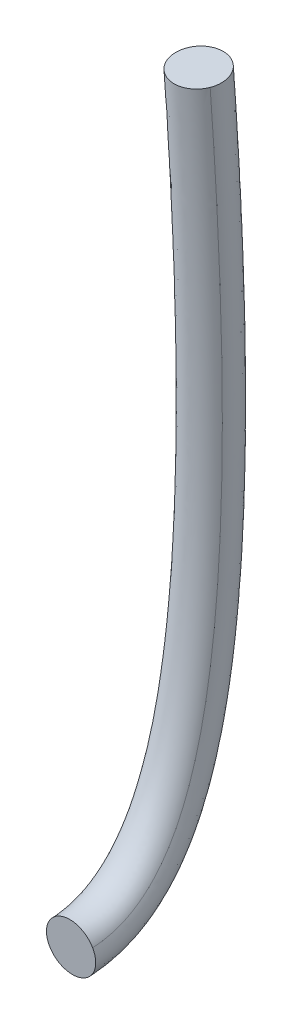
ISO-10303-21;
HEADER;
FILE_DESCRIPTION(('STEP AP214'),'2;1');
FILE_NAME('part.step','',(''),(''),'','','');
FILE_SCHEMA(('AUTOMOTIVE_DESIGN { 1 0 10303 214 1 1 1 1 }'));
ENDSEC;
DATA;
#1=APPLICATION_CONTEXT('core data for automotive mechanical design processes');
#2=APPLICATION_PROTOCOL_DEFINITION('international standard','automotive_design',2000,#1);
#3=PRODUCT_CONTEXT('',#1,'mechanical');
#4=PRODUCT('Part','Part','',(#3));
#5=PRODUCT_RELATED_PRODUCT_CATEGORY('part','',(#4));
#6=PRODUCT_DEFINITION_FORMATION('','',#4);
#7=PRODUCT_DEFINITION_CONTEXT('part definition',#1,'design');
#8=PRODUCT_DEFINITION('design','',#6,#7);
#9=PRODUCT_DEFINITION_SHAPE('','',#8);
#10=(LENGTH_UNIT() NAMED_UNIT(*) SI_UNIT(.MILLI.,.METRE.));
#11=(NAMED_UNIT(*) PLANE_ANGLE_UNIT() SI_UNIT($,.RADIAN.));
#12=(NAMED_UNIT(*) SI_UNIT($,.STERADIAN.) SOLID_ANGLE_UNIT());
#13=UNCERTAINTY_MEASURE_WITH_UNIT(LENGTH_MEASURE(1.E-05),#10,'distance_accuracy_value','');
#14=(GEOMETRIC_REPRESENTATION_CONTEXT(3) GLOBAL_UNCERTAINTY_ASSIGNED_CONTEXT((#13)) GLOBAL_UNIT_ASSIGNED_CONTEXT((#10,
#11,#12)) REPRESENTATION_CONTEXT('',''));
#15=CARTESIAN_POINT('',(0.,0.,0.));
#16=DIRECTION('',(0.,0.,1.));
#17=DIRECTION('',(1.,0.,0.));
#18=AXIS2_PLACEMENT_3D('',#15,#16,#17);
#19=CARTESIAN_POINT('',(4.01287620497938,-7.28809493712318,11.1726740111274));
#20=CARTESIAN_POINT('',(4.01287620497948,-7.28391225419948,11.0968550305643));
#21=CARTESIAN_POINT('',(4.01287620497963,-7.25716119494319,10.9541601069187));
#22=CARTESIAN_POINT('',(4.01287620497976,-7.1314491176281,10.6996024126014));
#23=CARTESIAN_POINT('',(4.01287620497965,-6.82482587490301,10.4240608609218));
#24=CARTESIAN_POINT('',(4.01287620497927,-6.165873157696,10.1770941489155));
#25=CARTESIAN_POINT('',(4.01287620497877,-5.06029644687231,10.0061296705981));
#26=CARTESIAN_POINT('',(4.01287620497848,-3.38305310437188,9.96226618792651));
#27=CARTESIAN_POINT('',(4.01287620497894,-1.8408728210868,10.0365898836467));
#28=CARTESIAN_POINT('',(4.01287620497939,-1.00711974407007,10.0974833884059));
#29=CARTESIAN_POINT('',(3.98375290779098,-7.22774571862693,11.1760032783344));
#30=CARTESIAN_POINT('',(3.98375290779108,-7.22383965460085,11.1051985346152));
#31=CARTESIAN_POINT('',(3.98375290779123,-7.19892557519891,10.9732426989536));
#32=CARTESIAN_POINT('',(3.98375290779136,-7.08368813312381,10.739637495315));
#33=CARTESIAN_POINT('',(3.98375290779126,-6.79660600562802,10.479005346914));
#34=CARTESIAN_POINT('',(3.98375290779087,-6.15268216176301,10.2363583456067));
#35=CARTESIAN_POINT('',(3.98375290779038,-5.05654613295629,10.0666574594048));
#36=CARTESIAN_POINT('',(3.98375290779009,-3.3843495567675,10.0227004836965));
#37=CARTESIAN_POINT('',(3.98375290779054,-1.84433494354683,10.096938994066));
#38=CARTESIAN_POINT('',(3.98375290779099,-1.0115223498947,10.1577638102292));
#39=CARTESIAN_POINT('',(3.88201580447954,-7.14685073277138,11.1804659877171));
#40=CARTESIAN_POINT('',(3.88201580447964,-7.14331545469164,11.1163824353893));
#41=CARTESIAN_POINT('',(3.88201580447979,-7.12086386158283,10.9988217341809));
#42=CARTESIAN_POINT('',(3.88201580447992,-7.01966693643439,10.7933018546966));
#43=CARTESIAN_POINT('',(3.88201580447982,-6.75877859430067,10.5526550544248));
#44=CARTESIAN_POINT('',(3.88201580447943,-6.13500008848618,10.3157985827973));
#45=CARTESIAN_POINT('',(3.88201580447894,-5.05151887425311,10.1477916249694));
#46=CARTESIAN_POINT('',(3.88201580447865,-3.38608722835044,10.1037094182803));
#47=CARTESIAN_POINT('',(3.88201580447911,-1.8489757632529,10.1778338332407));
#48=CARTESIAN_POINT('',(3.88201580447955,-1.01742381382055,10.238566577726));
#49=CARTESIAN_POINT('',(3.70452611217511,-7.1676447435489,11.1793188507711));
#50=CARTESIAN_POINT('',(3.7045261121752,-7.16401384147644,11.1135019340509));
#51=CARTESIAN_POINT('',(3.70452611217535,-7.14093402141678,10.9922386488074));
#52=CARTESIAN_POINT('',(3.70452611217548,-7.0361199670932,10.7794822799129));
#53=CARTESIAN_POINT('',(3.70452611217538,-6.76849584205155,10.5337012343682));
#54=CARTESIAN_POINT('',(3.704526112175,-6.13953535833464,10.2953641607092));
#55=CARTESIAN_POINT('',(3.7045261121745,-5.05280432098519,10.1269281905872));
#56=CARTESIAN_POINT('',(3.70452611217422,-3.38563387235592,10.082882116471));
#57=CARTESIAN_POINT('',(3.70452611217467,-1.8477839096128,10.1570397822777));
#58=CARTESIAN_POINT('',(3.70452611217512,-1.01590684582571,10.217796271626));
#59=CARTESIAN_POINT('',(3.60405824176924,-7.26777335942295,11.173795085499));
#60=CARTESIAN_POINT('',(3.60405824176934,-7.26368440808216,11.0996751658486));
#61=CARTESIAN_POINT('',(3.60405824176949,-7.23754305715789,10.9606007791927));
#62=CARTESIAN_POINT('',(3.60405824176961,-7.11537309349189,10.7131305001567));
#63=CARTESIAN_POINT('',(3.60405824176951,-6.81533499688619,10.4426038864468));
#64=CARTESIAN_POINT('',(3.60405824176912,-6.1614497666812,10.1970771266467));
#65=CARTESIAN_POINT('',(3.60405824176863,-5.05904628454727,10.0265261880134));
#66=CARTESIAN_POINT('',(3.60405824176834,-3.38350213363878,9.98262387314061));
#67=CARTESIAN_POINT('',(3.6040582417688,-1.84203664376369,10.0569115701813));
#68=CARTESIAN_POINT('',(3.60405824176925,-1.0086022470513,10.1177817999912));
#69=CARTESIAN_POINT('',(3.58500000000068,-7.35208061372048,11.1691441325282));
#70=CARTESIAN_POINT('',(3.58500000000077,-7.34760369485504,11.0879915731232));
#71=CARTESIAN_POINT('',(3.58500000000092,-7.31891934484953,10.9339034308183));
#72=CARTESIAN_POINT('',(3.58500000000105,-7.18207719647453,10.6570787672874));
#73=CARTESIAN_POINT('',(3.58500000000094,-6.854727228942,10.3657384236238));
#74=CARTESIAN_POINT('',(3.58500000000056,-6.17982906409538,10.1142154553458));
#75=CARTESIAN_POINT('',(3.58500000000007,-5.06425215150658,9.94193063774786));
#76=CARTESIAN_POINT('',(3.58499999999978,-3.38165829949396,9.89817820607483));
#77=CARTESIAN_POINT('',(3.58500000000023,-1.83720530777411,9.97260408602737));
#78=CARTESIAN_POINT('',(3.58500000000068,-1.00245185077312,10.0335706539573));
#79=CARTESIAN_POINT('',(3.585,-7.38568943191456,11.1672900449514));
#80=CARTESIAN_POINT('',(3.58500000000009,-7.3810594674981,11.0833632476063));
#81=CARTESIAN_POINT('',(3.58500000000024,-7.35133686118168,10.9233018896209));
#82=CARTESIAN_POINT('',(3.58500000000037,-7.20868703416058,10.634863690535));
#83=CARTESIAN_POINT('',(3.58500000000027,-6.87046311339161,10.3352106768981));
#84=CARTESIAN_POINT('',(3.58499999999988,-6.18720691602205,10.0812568834996));
#85=CARTESIAN_POINT('',(3.58499999999939,-5.06636253415994,9.90824782223525));
#86=CARTESIAN_POINT('',(3.5849999999991,-3.38095772899273,9.86453482642554));
#87=CARTESIAN_POINT('',(3.58499999999955,-1.83527381521949,9.93899557759439));
#88=CARTESIAN_POINT('',(3.585,-1.00000001490137,10.0000001490162));
#89=B_SPLINE_SURFACE_WITH_KNOTS('',3,3,((#19,#20,#21,#22,#23,#24,#25,#26,#27,#28),(#29,#30,#31,
#32,#33,#34,#35,#36,#37,#38),(#39,#40,#41,#42,#43,#44,#45,#46,#47,#48),(#49,#50,#51,#52,#53,#54,
#55,#56,#57,#58),(#59,#60,#61,#62,#63,#64,#65,#66,#67,#68),(#69,#70,#71,#72,#73,#74,#75,#76,#77,
#78),(#79,#80,#81,#82,#83,#84,#85,#86,#87,#88)),.UNSPECIFIED.,.F.,.F.,.F.,(4,1,1,1,4),(4,1,1,1,
1,1,1,4),(0.448798950512828,1.34639685153848,2.01959527730772,2.69279370307697,
3.14159265358979),(0.,0.0714285714285714,0.142857142857143,0.285714285714286,0.428571428571429,
0.571428571428571,0.785714285714286,1.),.UNSPECIFIED.);
#90=CARTESIAN_POINT('',(3.585,-7.38568943191456,11.1672900449514));
#91=CARTESIAN_POINT('',(3.58500000000009,-7.3810594674981,11.0833632476063));
#92=CARTESIAN_POINT('',(3.58500000000024,-7.35133686118168,10.9233018896209));
#93=CARTESIAN_POINT('',(3.58500000000037,-7.20868703416058,10.634863690535));
#94=CARTESIAN_POINT('',(3.58500000000027,-6.87046311339161,10.3352106768981));
#95=CARTESIAN_POINT('',(3.58499999999988,-6.18720691602205,10.0812568834996));
#96=CARTESIAN_POINT('',(3.58499999999939,-5.06636253415994,9.90824782223525));
#97=CARTESIAN_POINT('',(3.5849999999991,-3.38095772899273,9.86453482642554));
#98=CARTESIAN_POINT('',(3.58499999999955,-1.83527381521949,9.93899557759439));
#99=CARTESIAN_POINT('',(3.585,-1.00000001490137,10.0000001490162));
#100=B_SPLINE_CURVE_WITH_KNOTS('',3,(#90,#91,#92,#93,#94,#95,#96,#97,#98,#99),.UNSPECIFIED.,.F.,
.F.,(4,1,1,1,1,1,1,4),(0.,0.0714285714285714,0.142857142857143,0.285714285714286,
0.428571428571429,0.571428571428571,0.785714285714286,1.),.UNSPECIFIED.);
#101=CARTESIAN_POINT('',(3.585,-7.38568943191456,11.1672900449514));
#102=VERTEX_POINT('',#101);
#103=CARTESIAN_POINT('',(3.585,-1.00000001490137,10.0000001490162));
#104=VERTEX_POINT('',#103);
#105=EDGE_CURVE('E11',#102,#104,#100,.T.);
#106=CARTESIAN_POINT('',(3.585,-7.38568943191456,11.1672900449514));
#107=CARTESIAN_POINT('',(3.58500897395703,-7.3983816093523,11.1665898594116));
#108=CARTESIAN_POINT('',(3.58613098343656,-7.41108378688621,11.1658891221995));
#109=CARTESIAN_POINT('',(3.59051216233813,-7.43613058949724,11.1645073727642));
#110=CARTESIAN_POINT('',(3.59377562751158,-7.4484744436958,11.1638264030679));
#111=CARTESIAN_POINT('',(3.60228032219361,-7.47243498249087,11.1625045792223));
#112=CARTESIAN_POINT('',(3.60751752800551,-7.48405309080503,11.1618636465311));
#113=CARTESIAN_POINT('',(3.61983572155987,-7.50626221756838,11.1606384423069));
#114=CARTESIAN_POINT('',(3.62691564724126,-7.5168538228379,11.1600541384008));
#115=CARTESIAN_POINT('',(3.64289444961349,-7.53685977257439,11.1589504761818));
#116=CARTESIAN_POINT('',(3.65182083606302,-7.54625236056585,11.1584323181018));
#117=CARTESIAN_POINT('',(3.67122368934338,-7.56326927128758,11.1574935513001));
#118=CARTESIAN_POINT('',(3.68169927755292,-7.57089459006273,11.1570728876299));
#119=CARTESIAN_POINT('',(3.70322424042484,-7.58383189645702,11.1563591791347));
#120=CARTESIAN_POINT('',(3.71421265075988,-7.5892460713144,11.1560604969768));
#121=CARTESIAN_POINT('',(3.73691686089652,-7.59828458911192,11.1555618717808));
#122=CARTESIAN_POINT('',(3.7486335454821,-7.60190670506499,11.1553620515981));
#123=CARTESIAN_POINT('',(3.77315340294371,-7.60743276165738,11.1550571972942));
#124=CARTESIAN_POINT('',(3.78598078448956,-7.60923017552701,11.1549580399033));
#125=CARTESIAN_POINT('',(3.8117445934974,-7.61065910097915,11.1548792108022));
#126=CARTESIAN_POINT('',(3.82468085849553,-7.61029341040312,11.1548993847443));
#127=CARTESIAN_POINT('',(3.85025549109904,-7.60727026510154,11.155066161693));
#128=CARTESIAN_POINT('',(3.86289454775911,-7.60461879104279,11.1552124347659));
#129=CARTESIAN_POINT('',(3.88749119500077,-7.59709046615236,11.1556277476035));
#130=CARTESIAN_POINT('',(3.89944839783918,-7.59221236304532,11.1558968564522));
#131=CARTESIAN_POINT('',(3.92179051200648,-7.58083360871834,11.1565245847738));
#132=CARTESIAN_POINT('',(3.93222440178752,-7.57442775476059,11.1568779745948));
#133=CARTESIAN_POINT('',(3.95197552274883,-7.56007387970219,11.1576698305081));
#134=CARTESIAN_POINT('',(3.96129210740674,-7.55212497262175,11.158108345477));
#135=CARTESIAN_POINT('',(3.97922168959575,-7.53420906627699,11.1590967069001));
#136=CARTESIAN_POINT('',(3.98772836061025,-7.52413497353887,11.1596524613479));
#137=CARTESIAN_POINT('',(4.00280995574618,-7.50266405543227,11.160836941037));
#138=CARTESIAN_POINT('',(4.00938781766167,-7.49126927894329,11.1614655532484));
#139=CARTESIAN_POINT('',(4.02513007614966,-7.45681821240821,11.1633661048863));
#140=CARTESIAN_POINT('',(4.03142271536091,-7.43237451709741,11.1647145828824));
#141=CARTESIAN_POINT('',(4.03492525666866,-7.39526756721628,11.1667616508391));
#142=CARTESIAN_POINT('',(4.03508821265541,-7.38275776019196,11.1674517756051));
#143=CARTESIAN_POINT('',(4.0334220682958,-7.35785666288847,11.1688254869594));
#144=CARTESIAN_POINT('',(4.03159405692614,-7.34546531155682,11.1695090769158));
#145=CARTESIAN_POINT('',(4.02578544840758,-7.32053644450116,11.1708843202357));
#146=CARTESIAN_POINT('',(4.02170194045113,-7.30802251664015,11.1715746723347));
#147=CARTESIAN_POINT('',(4.01127814286342,-7.28397227606187,11.1729014447317));
#148=CARTESIAN_POINT('',(4.00493921468446,-7.27243537876386,11.173537897279));
#149=CARTESIAN_POINT('',(3.9908383703381,-7.25147048631181,11.1746944612028));
#150=CARTESIAN_POINT('',(3.98321202477996,-7.24195040886817,11.1752196524552));
#151=CARTESIAN_POINT('',(3.96655038265875,-7.22421215608424,11.1761982133177));
#152=CARTESIAN_POINT('',(3.95751328660325,-7.21599567091939,11.1766514896864));
#153=CARTESIAN_POINT('',(3.93769854106373,-7.20061437850308,11.1775000248244));
#154=CARTESIAN_POINT('',(3.926849287094,-7.19354134180442,11.1778902209151));
#155=CARTESIAN_POINT('',(3.90413321165923,-7.18130421177467,11.1785653029912));
#156=CARTESIAN_POINT('',(3.89226779917205,-7.17613752630499,11.1788503319764));
#157=CARTESIAN_POINT('',(3.8677994988514,-7.16798776021992,11.1792999276737));
#158=CARTESIAN_POINT('',(3.85519657484898,-7.16500478679493,11.1794644884725));
#159=CARTESIAN_POINT('',(3.82965228303294,-7.16133303869953,11.1796670466966));
#160=CARTESIAN_POINT('',(3.81671059959631,-7.16064648628035,11.1797049215276));
#161=CARTESIAN_POINT('',(3.79153274766549,-7.16143887574948,11.1796612080158));
#162=CARTESIAN_POINT('',(3.77929289865516,-7.16281404538018,11.1795853444459));
#163=CARTESIAN_POINT('',(3.75519301432324,-7.1674876595239,11.1793275165784));
#164=CARTESIAN_POINT('',(3.74333273281618,-7.17078482962882,11.1791456225857));
#165=CARTESIAN_POINT('',(3.71975995850429,-7.17948556207932,11.1786656318924));
#166=CARTESIAN_POINT('',(3.70808168839048,-7.18498235964454,11.1783623917125));
#167=CARTESIAN_POINT('',(3.68585472820904,-7.19791917476699,11.177648710319));
#168=CARTESIAN_POINT('',(3.67530667830097,-7.20536028546965,11.1772382088002));
#169=CARTESIAN_POINT('',(3.65584571857485,-7.22169686261959,11.1763369737562));
#170=CARTESIAN_POINT('',(3.64689959385947,-7.23055306264185,11.1758484064302));
#171=CARTESIAN_POINT('',(3.63057749103941,-7.24960683327071,11.1747972727899));
#172=CARTESIAN_POINT('',(3.62320106478027,-7.2598040196721,11.174234727671));
#173=CARTESIAN_POINT('',(3.61015540007365,-7.28152295779833,11.173036565536));
#174=CARTESIAN_POINT('',(3.60452416230109,-7.29306753413178,11.1723996893616));
#175=CARTESIAN_POINT('',(3.59535168419828,-7.31694794076783,11.1710822861427));
#176=CARTESIAN_POINT('',(3.59180874213945,-7.32928311770451,11.1704017951422));
#177=CARTESIAN_POINT('',(3.58789276457272,-7.3490385563206,11.1693119527949));
#178=CARTESIAN_POINT('',(3.58681269063158,-7.35632736410319,11.1689098533256));
#179=CARTESIAN_POINT('',(3.58536386706378,-7.37097282577124,11.1681019115415));
#180=CARTESIAN_POINT('',(3.58499479615029,-7.3783294475023,11.1676960710004));
#181=CARTESIAN_POINT('',(3.585,-7.38568943191456,11.1672900449514));
#182=B_SPLINE_CURVE_WITH_KNOTS('',3,(#106,#107,#108,#109,#110,#111,#112,#113,#114,#115,#116,
#117,#118,#119,#120,#121,#122,#123,#124,#125,#126,#127,#128,#129,#130,#131,#132,#133,#134,#135,
#136,#137,#138,#139,#140,#141,#142,#143,#144,#145,#146,#147,#148,#149,#150,#151,#152,#153,#154,
#155,#156,#157,#158,#159,#160,#161,#162,#163,#164,#165,#166,#167,#168,#169,#170,#171,#172,#173,
#174,#175,#176,#177,#178,#179,#180,#181),.UNSPECIFIED.,.T.,.F.,(4,2,2,2,2,2,2,2,2,2,2,2,2,2,2,2,
2,2,2,2,2,2,2,2,2,2,2,2,2,2,2,2,2,2,2,2,2,4),(0.,0.0381076476228789,0.0762919736878916,
0.114398874047634,0.152483859748322,0.191183446294278,0.229861168160382,0.266463179628883,
0.303110562787149,0.341792066135605,0.380423548307842,0.418954258376205,0.457506665198648,
0.494104556813594,0.530723524445818,0.570108938597708,0.609434048950621,0.683600477642928,
0.721081721186101,0.758542474331799,0.797873442099295,0.837180708454477,0.873653570611327,
0.910173341957735,0.948867970246064,0.987509788362006,1.02615350313567,1.06483460270752,
1.10163302066017,1.13840706663949,1.17694061982934,1.2154958844162,1.25312420950083,
1.29074177710907,1.3291286959608,1.36748429034415,1.38959227930151,1.41169027579327),.UNSPECIFIED.);
#183=CARTESIAN_POINT('',(4.01287620497938,-7.28809493712318,11.1726740111274));
#184=VERTEX_POINT('',#183);
#185=EDGE_CURVE('E45',#184,#102,#182,.T.);
#186=CARTESIAN_POINT('',(4.01287620497938,-7.28809493712318,11.1726740111274));
#187=CARTESIAN_POINT('',(4.01287620497948,-7.28391225419948,11.0968550305643));
#188=CARTESIAN_POINT('',(4.01287620497963,-7.25716119494319,10.9541601069187));
#189=CARTESIAN_POINT('',(4.01287620497976,-7.1314491176281,10.6996024126014));
#190=CARTESIAN_POINT('',(4.01287620497965,-6.82482587490301,10.4240608609218));
#191=CARTESIAN_POINT('',(4.01287620497927,-6.165873157696,10.1770941489155));
#192=CARTESIAN_POINT('',(4.01287620497877,-5.06029644687231,10.0061296705981));
#193=CARTESIAN_POINT('',(4.01287620497848,-3.38305310437188,9.96226618792651));
#194=CARTESIAN_POINT('',(4.01287620497894,-1.8408728210868,10.0365898836467));
#195=CARTESIAN_POINT('',(4.01287620497939,-1.00711974407007,10.0974833884059));
#196=B_SPLINE_CURVE_WITH_KNOTS('',3,(#186,#187,#188,#189,#190,#191,#192,#193,#194,#195),
.UNSPECIFIED.,.F.,.F.,(4,1,1,1,1,1,1,4),(0.,0.0714285714285714,0.142857142857143,
0.285714285714286,0.428571428571429,0.571428571428571,0.785714285714286,1.),.UNSPECIFIED.);
#197=CARTESIAN_POINT('',(4.01287620497939,-1.00711974407007,10.0974833884059));
#198=VERTEX_POINT('',#197);
#199=EDGE_CURVE('E29',#184,#198,#196,.T.);
#200=CARTESIAN_POINT('',(3.585,-1.00000001490137,10.0000001490162));
#201=CARTESIAN_POINT('',(3.58498686750316,-1.00091767469022,10.0125647349377));
#202=CARTESIAN_POINT('',(3.58606442665694,-1.00183518350766,10.0251272537605));
#203=CARTESIAN_POINT('',(3.59026690426186,-1.00364587594695,10.0499192311438));
#204=CARTESIAN_POINT('',(3.59339399174036,-1.0045390327527,10.0621483225386));
#205=CARTESIAN_POINT('',(3.60167901943343,-1.00627463946991,10.0859122271895));
#206=CARTESIAN_POINT('',(3.60683761576254,-1.00711707289784,10.0974468147534));
#207=CARTESIAN_POINT('',(3.61906540065471,-1.00872462656358,10.1194574186853));
#208=CARTESIAN_POINT('',(3.62613459448468,-1.00948974658826,10.129933432135));
#209=CARTESIAN_POINT('',(3.6418205341445,-1.01091684932496,10.1494733042878));
#210=CARTESIAN_POINT('',(3.65042012990228,-1.01157983685082,10.158550920889));
#211=CARTESIAN_POINT('',(3.66897877607696,-1.01279540915689,10.1751945211305));
#212=CARTESIAN_POINT('',(3.67893735329601,-1.01334803220177,10.1827610286902));
#213=CARTESIAN_POINT('',(3.70028806993773,-1.0143388911187,10.1963278561233));
#214=CARTESIAN_POINT('',(3.71171328359004,-1.01477336615842,10.2022766827293));
#215=CARTESIAN_POINT('',(3.73543098505414,-1.01549131704072,10.2121068568935));
#216=CARTESIAN_POINT('',(3.74772402849345,-1.01577469513227,10.2159868660459));
#217=CARTESIAN_POINT('',(3.77250929691488,-1.01618397106887,10.2215906668589));
#218=CARTESIAN_POINT('',(3.78499141853651,-1.01631315129901,10.2233594008937));
#219=CARTESIAN_POINT('',(3.81007282824311,-1.01642108333818,10.2248372049732));
#220=CARTESIAN_POINT('',(3.82267202701151,-1.01639994170374,10.2245477339888));
#221=CARTESIAN_POINT('',(3.8478766443466,-1.01619852831296,10.2217899844555));
#222=CARTESIAN_POINT('',(3.86047769361227,-1.01601526116936,10.2192806931033));
#223=CARTESIAN_POINT('',(3.88502656066076,-1.01548784375463,10.2120593007044));
#224=CARTESIAN_POINT('',(3.89697424699347,-1.01514366124097,10.2073467581932));
#225=CARTESIAN_POINT('',(3.91942416549538,-1.01433309464832,10.1962484909243));
#226=CARTESIAN_POINT('',(3.92996613838994,-1.01387248715856,10.1899418591513));
#227=CARTESIAN_POINT('',(3.94994198292688,-1.01283683911406,10.1757617795643));
#228=CARTESIAN_POINT('',(3.95937500873879,-1.01226171210063,10.1678871479592));
#229=CARTESIAN_POINT('',(3.97750099528457,-1.0109663388354,10.1501509140202));
#230=CARTESIAN_POINT('',(3.9860959394235,-1.01023875266612,10.1401888136314));
#231=CARTESIAN_POINT('',(4.00138740262592,-1.00868660719758,10.1189368580165));
#232=CARTESIAN_POINT('',(4.00808683172839,-1.00786219932545,10.1076490761286));
#233=CARTESIAN_POINT('',(4.02428718352616,-1.0053557082586,10.0733302329651));
#234=CARTESIAN_POINT('',(4.0308981385658,-1.00356845865472,10.04885923458));
#235=CARTESIAN_POINT('',(4.03481243302271,-1.00085470164045,10.0117025087539));
#236=CARTESIAN_POINT('',(4.03510866224193,-0.999941862134791,9.99920392208741));
#237=CARTESIAN_POINT('',(4.03370593924222,-0.998123247945836,9.97430348021038));
#238=CARTESIAN_POINT('',(4.03200797204746,-0.997217469996897,9.96190158028678));
#239=CARTESIAN_POINT('',(4.02645973134547,-0.995394186150157,9.93693720151599));
#240=CARTESIAN_POINT('',(4.02250746422692,-0.994478304010069,9.92439695513835));
#241=CARTESIAN_POINT('',(4.01233145657852,-0.992716380510431,9.90027272144391));
#242=CARTESIAN_POINT('',(4.00610934407259,-0.991870289625765,9.88868805602987));
#243=CARTESIAN_POINT('',(3.99222967179034,-0.9903339153999,9.86765204006526));
#244=CARTESIAN_POINT('',(3.9847147092841,-0.989636706494672,9.85810586478186));
#245=CARTESIAN_POINT('',(3.96827135740289,-0.988335774907398,9.84029352636977));
#246=CARTESIAN_POINT('',(3.95934104623611,-0.987732181575949,9.8320291343078));
#247=CARTESIAN_POINT('',(3.93972922756299,-0.98659912226168,9.81651530087941));
#248=CARTESIAN_POINT('',(3.92897430612004,-0.986076384155725,9.80935797751576));
#249=CARTESIAN_POINT('',(3.90643360910359,-0.985168507907153,9.79692734770098));
#250=CARTESIAN_POINT('',(3.8946492042565,-0.984783190167556,9.79165158221035));
#251=CARTESIAN_POINT('',(3.87027211591469,-0.984169232278974,9.78324527876671));
#252=CARTESIAN_POINT('',(3.8576763384683,-0.983941236070524,9.78012355763916));
#253=CARTESIAN_POINT('',(3.83212432889549,-0.983655133949669,9.77620625111303));
#254=CARTESIAN_POINT('',(3.81916790953815,-0.983597118009895,9.77541189761853));
#255=CARTESIAN_POINT('',(3.79404847371784,-0.983639634995976,9.77599403964045));
#256=CARTESIAN_POINT('',(3.78188207437187,-0.983731376065745,9.7772501571774));
#257=CARTESIAN_POINT('',(3.75788836111474,-0.984051694800383,9.78163595713582));
#258=CARTESIAN_POINT('',(3.74606121630202,-0.984280339503064,9.78476655743813));
#259=CARTESIAN_POINT('',(3.72219924174932,-0.984891267803804,9.79313137980469));
#260=CARTESIAN_POINT('',(3.7102119131349,-0.985283519652644,9.7985020870293));
#261=CARTESIAN_POINT('',(3.68738027708273,-0.986214129651265,9.81124398705509));
#262=CARTESIAN_POINT('',(3.67653459167352,-0.986752308792234,9.81861272886996));
#263=CARTESIAN_POINT('',(3.6472149634828,-0.988518170894136,9.84279088985576));
#264=CARTESIAN_POINT('',(3.6307456976195,-0.989928470001912,9.86210068693968));
#265=CARTESIAN_POINT('',(3.60493363196035,-0.993049701063667,9.90483654213668));
#266=CARTESIAN_POINT('',(3.5955695164142,-0.994759714706253,9.92825002674207));
#267=CARTESIAN_POINT('',(3.58678991919931,-0.997670631930001,9.96810626759803));
#268=CARTESIAN_POINT('',(3.58501666599202,-0.998835444987373,9.98405487286515));
#269=CARTESIAN_POINT('',(3.585,-1.00000001490137,10.0000001490162));
#270=B_SPLINE_CURVE_WITH_KNOTS('',3,(#200,#201,#202,#203,#204,#205,#206,#207,#208,#209,#210,
#211,#212,#213,#214,#215,#216,#217,#218,#219,#220,#221,#222,#223,#224,#225,#226,#227,#228,#229,
#230,#231,#232,#233,#234,#235,#236,#237,#238,#239,#240,#241,#242,#243,#244,#245,#246,#247,#248,
#249,#250,#251,#252,#253,#254,#255,#256,#257,#258,#259,#260,#261,#262,#263,#264,#265,#266,#267,
#268,#269),.UNSPECIFIED.,.T.,.F.,(4,2,2,2,2,2,2,2,2,2,2,2,2,2,2,2,2,2,2,2,2,2,2,2,2,2,2,2,2,2,2,
2,2,2,4),(0.,0.0377493308242273,0.0755386766264733,0.113340237241438,0.151141902064286,
0.188543944427876,0.225932996460072,0.264400927587846,0.302893715151218,0.340551605948236,
0.378182805390208,0.416524136437636,0.454873153212507,0.491602130422702,0.528358942730316,
0.567688557323556,0.606957460429141,0.681503714098817,0.719001290675296,0.756480353282712,
0.795807356533379,0.835106208163839,0.871458652333629,0.907860886350189,0.946473825707883,
0.985036114628699,1.0237553231081,1.06249502243761,1.09904107397157,1.13560503571863,
1.17482937122328,1.21400580628458,1.28871954135104,1.36320823603134,1.41111459030922),.UNSPECIFIED.);
#271=EDGE_CURVE('E48',#104,#198,#270,.T.);
#272=ORIENTED_EDGE('',*,*,#105,.F.);
#273=ORIENTED_EDGE('',*,*,#185,.F.);
#274=ORIENTED_EDGE('',*,*,#199,.T.);
#275=ORIENTED_EDGE('',*,*,#271,.F.);
#276=EDGE_LOOP('',(#272,#273,#274,#275));
#277=FACE_BOUND('',#276,.T.);
#278=ADVANCED_FACE('F17',(#277),#89,.F.);
#279=CARTESIAN_POINT('',(3.81,-1.00000001490116,10.0000001490116));
#280=DIRECTION('',(-5.32623886368089E-13,-0.997343536648528,-0.0728414024124084));
#281=DIRECTION('',(0.,0.0728414024124084,-0.997343536648528));
#282=AXIS2_PLACEMENT_3D('',#279,#280,#281);
#283=PLANE('',#282);
#284=ORIENTED_EDGE('',*,*,#271,.T.);
#285=EDGE_CURVE('E80',#198,#104,#270,.T.);
#286=ORIENTED_EDGE('',*,*,#285,.T.);
#287=EDGE_LOOP('',(#284,#286));
#288=FACE_BOUND('',#287,.T.);
#289=ADVANCED_FACE('F72',(#288),#283,.F.);
#290=CARTESIAN_POINT('',(3.81,-7.38568943191911,11.1672900449514));
#291=DIRECTION('',(-1.11249196396045E-12,-0.0550829445172842,0.998481782118886));
#292=DIRECTION('',(0.,-0.998481782118886,-0.0550829445172842));
#293=AXIS2_PLACEMENT_3D('',#290,#291,#292);
#294=PLANE('',#293);
#295=EDGE_CURVE('E52',#102,#184,#182,.T.);
#296=ORIENTED_EDGE('',*,*,#295,.T.);
#297=ORIENTED_EDGE('',*,*,#185,.T.);
#298=EDGE_LOOP('',(#296,#297));
#299=FACE_BOUND('',#298,.T.);
#300=ADVANCED_FACE('F51',(#299),#294,.T.);
#301=CARTESIAN_POINT('',(3.585,-7.38568943191456,11.1672900449514));
#302=CARTESIAN_POINT('',(3.58500000000009,-7.3810594674981,11.0833632476063));
#303=CARTESIAN_POINT('',(3.58500000000024,-7.35133686118168,10.9233018896209));
#304=CARTESIAN_POINT('',(3.58500000000037,-7.20868703416058,10.634863690535));
#305=CARTESIAN_POINT('',(3.58500000000027,-6.87046311339161,10.3352106768981));
#306=CARTESIAN_POINT('',(3.58499999999988,-6.18720691602205,10.0812568834996));
#307=CARTESIAN_POINT('',(3.58499999999939,-5.06636253415994,9.90824782223525));
#308=CARTESIAN_POINT('',(3.5849999999991,-3.38095772899273,9.86453482642554));
#309=CARTESIAN_POINT('',(3.58499999999955,-1.83527381521949,9.93899557759439));
#310=CARTESIAN_POINT('',(3.585,-1.00000001490137,10.0000001490162));
#311=CARTESIAN_POINT('',(3.58499999999898,-7.43610265920569,11.1645089135862));
#312=CARTESIAN_POINT('',(3.58499999999908,-7.43123996642441,11.0763634777044));
#313=CARTESIAN_POINT('',(3.58499999999922,-7.40000786658982,10.907318895682));
#314=CARTESIAN_POINT('',(3.58499999999935,-7.24856570381251,10.6012873914474));
#315=CARTESIAN_POINT('',(3.58499999999925,-6.89400380306154,10.2891953667143));
#316=CARTESIAN_POINT('',(3.58499999999886,-6.19817398670051,10.0316744227515));
#317=CARTESIAN_POINT('',(3.58499999999837,-5.06945952930515,9.85764358282736));
#318=CARTESIAN_POINT('',(3.58499999999808,-3.37983949135664,9.81402945392876));
#319=CARTESIAN_POINT('',(3.58499999999853,-1.83238732027909,9.8885820302603));
#320=CARTESIAN_POINT('',(3.58499999999898,-0.996322261093759,9.94964439160444));
#321=CARTESIAN_POINT('',(3.60867759165921,-7.50284673867927,11.1608268630047));
#322=CARTESIAN_POINT('',(3.6086775916593,-7.4976806307518,11.0671814579664));
#323=CARTESIAN_POINT('',(3.60867759165945,-7.46437877440929,10.8862784557348));
#324=CARTESIAN_POINT('',(3.60867759165958,-7.30141637232743,10.5572119592863));
#325=CARTESIAN_POINT('',(3.60867759165947,-6.92526422890058,10.2286067913328));
#326=CARTESIAN_POINT('',(3.60867759165908,-6.21284212640295,9.96624544630293));
#327=CARTESIAN_POINT('',(3.60867759165859,-5.07366183301246,9.79076570586648));
#328=CARTESIAN_POINT('',(3.6086775916583,-3.37845929903303,9.74722336426859));
#329=CARTESIAN_POINT('',(3.60867759165876,-1.82854978412165,9.82183869494502));
#330=CARTESIAN_POINT('',(3.60867759165921,-0.991453136349937,9.8829763987931));
#331=CARTESIAN_POINT('',(3.70415601422853,-7.59922715176153,11.1555098737102));
#332=CARTESIAN_POINT('',(3.70415601422862,-7.59361792058144,11.0538320277984));
#333=CARTESIAN_POINT('',(3.70415601422877,-7.55740279114177,10.8557682193715));
#334=CARTESIAN_POINT('',(3.70415601422889,-7.37767738843647,10.4931657214967));
#335=CARTESIAN_POINT('',(3.70415601422879,-6.97030564621338,10.140762384628));
#336=CARTESIAN_POINT('',(3.7041560142284,-6.23386612950499,9.87153606552763));
#337=CARTESIAN_POINT('',(3.70415601422791,-5.07962194556758,9.69406591298153));
#338=CARTESIAN_POINT('',(3.70415601422762,-3.37636001058458,9.65068985541218));
#339=CARTESIAN_POINT('',(3.70415601422808,-1.8230252104349,9.72545811913064));
#340=CARTESIAN_POINT('',(3.70415601422852,-0.98442197706424,9.78670585708818));
#341=CARTESIAN_POINT('',(3.86709892095274,-7.63627496575696,11.1534660680853));
#342=CARTESIAN_POINT('',(3.86709892095283,-7.63049691335548,11.0487280205903));
#343=CARTESIAN_POINT('',(3.86709892095298,-7.59313903783295,10.8440789373108));
#344=CARTESIAN_POINT('',(3.8670989209531,-7.40700873886717,10.468668239963));
#345=CARTESIAN_POINT('',(3.867098920953,-6.98764938684779,10.1071027411063));
#346=CARTESIAN_POINT('',(3.86709892095261,-6.24199527298344,9.83519975289846));
#347=CARTESIAN_POINT('',(3.86709892095212,-5.0819457669496,9.65693360774699));
#348=CARTESIAN_POINT('',(3.86709892095183,-3.37558529396147,9.61360247161449));
#349=CARTESIAN_POINT('',(3.86709892095228,-1.82089647179759,9.68841061793554));
#350=CARTESIAN_POINT('',(3.86709892095273,-0.981719259021723,9.74970027671905));
#351=CARTESIAN_POINT('',(4.04222171570832,-7.49738961719812,11.1611279143865));
#352=CARTESIAN_POINT('',(4.04222171570842,-7.49224759515358,11.0679191111945));
#353=CARTESIAN_POINT('',(4.04222171570856,-7.45912590667477,10.8879803298607));
#354=CARTESIAN_POINT('',(4.04222171570869,-7.29708695821882,10.5607576954698));
#355=CARTESIAN_POINT('',(4.04222171570858,-6.92269389404674,10.2335095252594));
#356=CARTESIAN_POINT('',(4.04222171570819,-6.21162005361603,9.97156200796289));
#357=CARTESIAN_POINT('',(4.0422217157077,-5.07330257793447,9.79621548720947));
#358=CARTESIAN_POINT('',(4.04222171570741,-3.37855675277434,9.75267634860102));
#359=CARTESIAN_POINT('',(4.04222171570787,-1.82886600273641,9.82729557632134));
#360=CARTESIAN_POINT('',(4.04222171570832,-0.991851245147888,9.88842729928564));
#361=CARTESIAN_POINT('',(4.04199950216779,-7.34844415561944,11.1693447439203));
#362=CARTESIAN_POINT('',(4.04199950216788,-7.34398485379812,11.0885115265134));
#363=CARTESIAN_POINT('',(4.04199950216803,-7.31539681468747,10.9350775148837));
#364=CARTESIAN_POINT('',(4.04199950216816,-7.1792101021324,10.6595673298879));
#365=CARTESIAN_POINT('',(4.04199950216805,-6.85304574417801,10.3691163749297));
#366=CARTESIAN_POINT('',(4.04199950216766,-6.179064153629,10.1178299522242));
#367=CARTESIAN_POINT('',(4.04199950216717,-5.06404676078832,9.94560188179129));
#368=CARTESIAN_POINT('',(4.04199950216688,-3.38175665197627,9.90183189215653));
#369=CARTESIAN_POINT('',(4.04199950216734,-1.83741069862676,9.97624077322738));
#370=CARTESIAN_POINT('',(4.04199950216779,-1.00271713824544,10.0372029665826));
#371=CARTESIAN_POINT('',(4.01287620497938,-7.28809493712318,11.1726740111274));
#372=CARTESIAN_POINT('',(4.01287620497948,-7.28391225419948,11.0968550305643));
#373=CARTESIAN_POINT('',(4.01287620497963,-7.25716119494319,10.9541601069187));
#374=CARTESIAN_POINT('',(4.01287620497976,-7.1314491176281,10.6996024126014));
#375=CARTESIAN_POINT('',(4.01287620497965,-6.82482587490301,10.4240608609218));
#376=CARTESIAN_POINT('',(4.01287620497927,-6.165873157696,10.1770941489155));
#377=CARTESIAN_POINT('',(4.01287620497877,-5.06029644687231,10.0061296705981));
#378=CARTESIAN_POINT('',(4.01287620497848,-3.38305310437188,9.96226618792651));
#379=CARTESIAN_POINT('',(4.01287620497894,-1.8408728210868,10.0365898836467));
#380=CARTESIAN_POINT('',(4.01287620497939,-1.00711974407007,10.0974833884059));
#381=B_SPLINE_SURFACE_WITH_KNOTS('',3,3,((#301,#302,#303,#304,#305,#306,#307,#308,#309,#310),
(#311,#312,#313,#314,#315,#316,#317,#318,#319,#320),(#321,#322,#323,#324,#325,#326,#327,#328,
#329,#330),(#331,#332,#333,#334,#335,#336,#337,#338,#339,#340),(#341,#342,#343,#344,#345,#346,
#347,#348,#349,#350),(#351,#352,#353,#354,#355,#356,#357,#358,#359,#360),(#361,#362,#363,#364,
#365,#366,#367,#368,#369,#370),(#371,#372,#373,#374,#375,#376,#377,#378,#379,#380)),
.UNSPECIFIED.,.F.,.F.,.F.,(4,1,1,1,1,4),(4,1,1,1,1,1,1,4),(-3.14159265358979,-2.46839422782055,
-2.24399475256414,-1.34639685153848,-0.448798950512828,0.448798950512828),(0.,
0.0714285714285714,0.142857142857143,0.285714285714286,0.428571428571429,0.571428571428571,
0.785714285714286,1.),.UNSPECIFIED.);
#382=ORIENTED_EDGE('',*,*,#295,.F.);
#383=ORIENTED_EDGE('',*,*,#105,.T.);
#384=ORIENTED_EDGE('',*,*,#285,.F.);
#385=ORIENTED_EDGE('',*,*,#199,.F.);
#386=EDGE_LOOP('',(#382,#383,#384,#385));
#387=FACE_BOUND('',#386,.T.);
#388=ADVANCED_FACE('F54',(#387),#381,.F.);
#389=CLOSED_SHELL('',(#278,#289,#300,#388));
#390=MANIFOLD_SOLID_BREP('B1',#389);
#391=ADVANCED_BREP_SHAPE_REPRESENTATION('',(#18,#390),#14);
#392=SHAPE_DEFINITION_REPRESENTATION(#9,#391);
ENDSEC;
END-ISO-10303-21;
